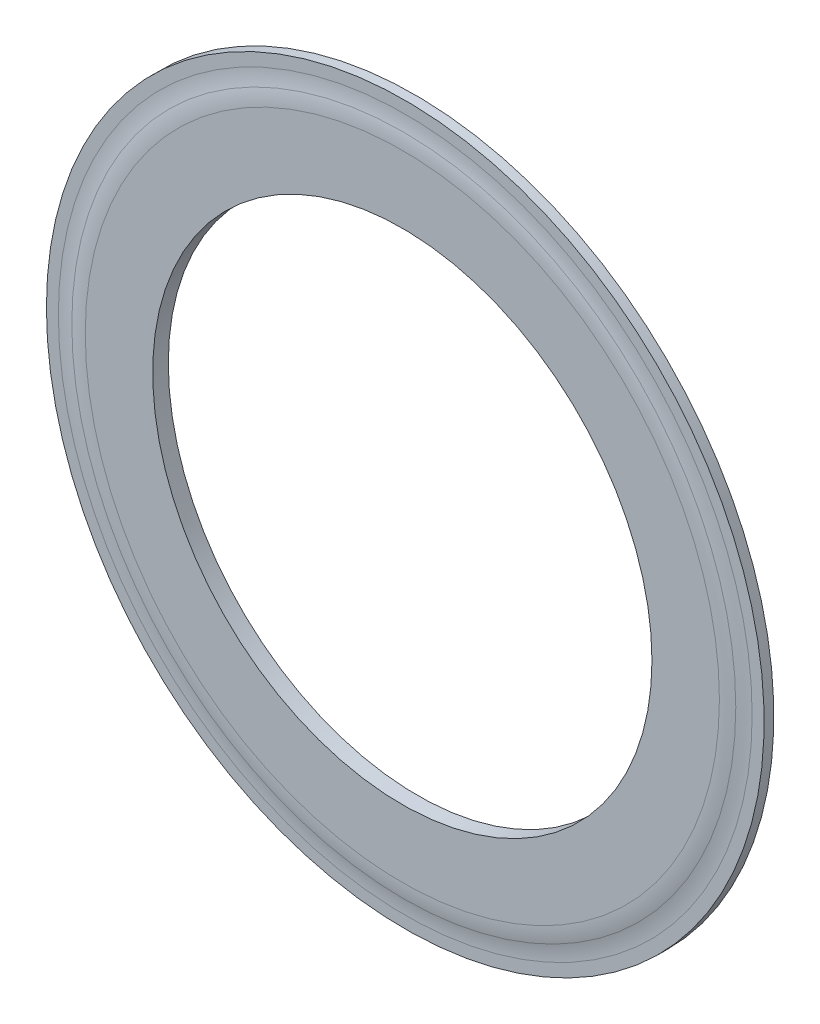
ISO-10303-21;
HEADER;
FILE_DESCRIPTION(('STEP AP214'),'2;1');
FILE_NAME('part.step','',(''),(''),'','','');
FILE_SCHEMA(('AUTOMOTIVE_DESIGN { 1 0 10303 214 1 1 1 1 }'));
ENDSEC;
DATA;
#1=APPLICATION_CONTEXT('core data for automotive mechanical design processes');
#2=APPLICATION_PROTOCOL_DEFINITION('international standard','automotive_design',2000,#1);
#3=PRODUCT_CONTEXT('',#1,'mechanical');
#4=PRODUCT('Part','Part','',(#3));
#5=PRODUCT_RELATED_PRODUCT_CATEGORY('part','',(#4));
#6=PRODUCT_DEFINITION_FORMATION('','',#4);
#7=PRODUCT_DEFINITION_CONTEXT('part definition',#1,'design');
#8=PRODUCT_DEFINITION('design','',#6,#7);
#9=PRODUCT_DEFINITION_SHAPE('','',#8);
#10=(LENGTH_UNIT() NAMED_UNIT(*) SI_UNIT(.MILLI.,.METRE.));
#11=(NAMED_UNIT(*) PLANE_ANGLE_UNIT() SI_UNIT($,.RADIAN.));
#12=(NAMED_UNIT(*) SI_UNIT($,.STERADIAN.) SOLID_ANGLE_UNIT());
#13=UNCERTAINTY_MEASURE_WITH_UNIT(LENGTH_MEASURE(1.E-05),#10,'distance_accuracy_value','');
#14=(GEOMETRIC_REPRESENTATION_CONTEXT(3) GLOBAL_UNCERTAINTY_ASSIGNED_CONTEXT((#13)) GLOBAL_UNIT_ASSIGNED_CONTEXT((#10,
#11,#12)) REPRESENTATION_CONTEXT('',''));
#15=CARTESIAN_POINT('',(0.,0.,0.));
#16=DIRECTION('',(0.,0.,1.));
#17=DIRECTION('',(1.,0.,0.));
#18=AXIS2_PLACEMENT_3D('',#15,#16,#17);
#19=CARTESIAN_POINT('',(0.,36.5125,-0.49609375));
#20=DIRECTION('',(0.,0.,-1.));
#21=DIRECTION('',(-1.,0.,0.));
#22=AXIS2_PLACEMENT_3D('',#19,#20,#21);
#23=PLANE('',#22);
#24=CARTESIAN_POINT('',(0.,0.,-0.49609375));
#25=DIRECTION('',(0.,0.,-1.));
#26=DIRECTION('',(-1.,0.,0.));
#27=AXIS2_PLACEMENT_3D('',#24,#25,#26);
#28=CIRCLE('',#27,36.5125);
#29=CARTESIAN_POINT('',(-36.5125,0.,-0.49609375));
#30=VERTEX_POINT('',#29);
#31=EDGE_CURVE('E10',#30,#30,#28,.T.);
#32=ORIENTED_EDGE('',*,*,#31,.T.);
#33=EDGE_LOOP('',(#32));
#34=FACE_BOUND('',#33,.T.);
#35=CARTESIAN_POINT('',(0.,0.,-0.496093749999999));
#36=DIRECTION('',(0.,0.,-1.));
#37=DIRECTION('',(-1.,0.,0.));
#38=AXIS2_PLACEMENT_3D('',#35,#36,#37);
#39=CIRCLE('',#38,35.2980625);
#40=CARTESIAN_POINT('',(-35.2980625,0.,-0.496093749999999));
#41=VERTEX_POINT('',#40);
#42=EDGE_CURVE('E69',#41,#41,#39,.T.);
#43=ORIENTED_EDGE('',*,*,#42,.F.);
#44=EDGE_LOOP('',(#43));
#45=FACE_BOUND('',#44,.T.);
#46=ADVANCED_FACE('F41',(#34,#45),#23,.T.);
#47=CARTESIAN_POINT('',(0.,0.,-0.793750000000004));
#48=DIRECTION('',(0.,0.,-1.));
#49=DIRECTION('',(-1.,0.,0.));
#50=AXIS2_PLACEMENT_3D('',#47,#48,#49);
#51=CYLINDRICAL_SURFACE('',#50,36.5125);
#52=CARTESIAN_POINT('',(0.,0.,0.49609375));
#53=DIRECTION('',(0.,0.,-1.));
#54=DIRECTION('',(-1.,0.,0.));
#55=AXIS2_PLACEMENT_3D('',#52,#53,#54);
#56=CIRCLE('',#55,36.5125);
#57=CARTESIAN_POINT('',(-36.5125,0.,0.49609375));
#58=VERTEX_POINT('',#57);
#59=EDGE_CURVE('E48',#58,#58,#56,.T.);
#60=ORIENTED_EDGE('',*,*,#59,.T.);
#61=EDGE_LOOP('',(#60));
#62=FACE_BOUND('',#61,.T.);
#63=ORIENTED_EDGE('',*,*,#31,.F.);
#64=EDGE_LOOP('',(#63));
#65=FACE_BOUND('',#64,.T.);
#66=ADVANCED_FACE('F100',(#62,#65),#51,.T.);
#67=CARTESIAN_POINT('',(0.,36.5125,0.49609375));
#68=DIRECTION('',(0.,0.,1.));
#69=DIRECTION('',(1.,0.,0.));
#70=AXIS2_PLACEMENT_3D('',#67,#68,#69);
#71=PLANE('',#70);
#72=CARTESIAN_POINT('',(0.,0.,0.49609375));
#73=DIRECTION('',(0.,0.,-1.));
#74=DIRECTION('',(-1.,0.,0.));
#75=AXIS2_PLACEMENT_3D('',#72,#73,#74);
#76=CIRCLE('',#75,35.2980625);
#77=CARTESIAN_POINT('',(-35.2980625,0.,0.49609375));
#78=VERTEX_POINT('',#77);
#79=EDGE_CURVE('E52',#78,#78,#76,.T.);
#80=ORIENTED_EDGE('',*,*,#79,.T.);
#81=EDGE_LOOP('',(#80));
#82=FACE_BOUND('',#81,.T.);
#83=ORIENTED_EDGE('',*,*,#59,.F.);
#84=EDGE_LOOP('',(#83));
#85=FACE_BOUND('',#84,.T.);
#86=ADVANCED_FACE('F104',(#82,#85),#71,.T.);
#87=CARTESIAN_POINT('',(0.,0.,8.31254687499955));
#88=DIRECTION('',(0.,0.,-1.));
#89=DIRECTION('',(-1.,0.,0.));
#90=AXIS2_PLACEMENT_3D('',#87,#88,#89);
#91=TOROIDAL_SURFACE('',#90,35.2980625,7.81645312499955);
#92=CARTESIAN_POINT('',(0.,0.,0.644921875000007));
#93=DIRECTION('',(0.,0.,-1.));
#94=DIRECTION('',(-1.,0.,0.));
#95=AXIS2_PLACEMENT_3D('',#92,#93,#94);
#96=CIRCLE('',#95,33.780015625);
#97=CARTESIAN_POINT('',(-33.780015625,0.,0.644921875000007));
#98=VERTEX_POINT('',#97);
#99=EDGE_CURVE('E57',#98,#98,#96,.T.);
#100=ORIENTED_EDGE('',*,*,#99,.T.);
#101=EDGE_LOOP('',(#100));
#102=FACE_BOUND('',#101,.T.);
#103=ORIENTED_EDGE('',*,*,#79,.F.);
#104=EDGE_LOOP('',(#103));
#105=FACE_BOUND('',#104,.T.);
#106=ADVANCED_FACE('F113',(#102,#105),#91,.F.);
#107=CARTESIAN_POINT('',(0.,0.,-7.02270312499954));
#108=DIRECTION('',(0.,0.,-1.));
#109=DIRECTION('',(-1.,0.,0.));
#110=AXIS2_PLACEMENT_3D('',#107,#108,#109);
#111=TOROIDAL_SURFACE('',#110,32.26196875,7.81645312499955);
#112=CARTESIAN_POINT('',(0.,0.,0.793750000000017));
#113=DIRECTION('',(0.,0.,-1.));
#114=DIRECTION('',(-1.,0.,0.));
#115=AXIS2_PLACEMENT_3D('',#112,#113,#114);
#116=CIRCLE('',#115,32.26196875);
#117=CARTESIAN_POINT('',(-32.26196875,0.,0.793750000000017));
#118=VERTEX_POINT('',#117);
#119=EDGE_CURVE('E60',#118,#118,#116,.T.);
#120=ORIENTED_EDGE('',*,*,#119,.T.);
#121=EDGE_LOOP('',(#120));
#122=FACE_BOUND('',#121,.T.);
#123=ORIENTED_EDGE('',*,*,#99,.F.);
#124=EDGE_LOOP('',(#123));
#125=FACE_BOUND('',#124,.T.);
#126=ADVANCED_FACE('F120',(#122,#125),#111,.T.);
#127=CARTESIAN_POINT('',(0.,32.26196875,0.793750000000017));
#128=DIRECTION('',(0.,0.,1.));
#129=DIRECTION('',(1.,0.,0.));
#130=AXIS2_PLACEMENT_3D('',#127,#128,#129);
#131=PLANE('',#130);
#132=CARTESIAN_POINT('',(0.,0.,0.793750000000017));
#133=DIRECTION('',(0.,0.,1.));
#134=DIRECTION('',(1.,0.,0.));
#135=AXIS2_PLACEMENT_3D('',#132,#133,#134);
#136=CIRCLE('',#135,25.4);
#137=CARTESIAN_POINT('',(25.4,0.,0.793750000000017));
#138=VERTEX_POINT('',#137);
#139=EDGE_CURVE('E72',#138,#138,#136,.T.);
#140=ORIENTED_EDGE('',*,*,#139,.F.);
#141=EDGE_LOOP('',(#140));
#142=FACE_BOUND('',#141,.T.);
#143=ORIENTED_EDGE('',*,*,#119,.F.);
#144=EDGE_LOOP('',(#143));
#145=FACE_BOUND('',#144,.T.);
#146=ADVANCED_FACE('F85',(#142,#145),#131,.T.);
#147=CARTESIAN_POINT('',(0.,32.26196875,-0.793750000000016));
#148=DIRECTION('',(0.,0.,-1.));
#149=DIRECTION('',(-1.,0.,0.));
#150=AXIS2_PLACEMENT_3D('',#147,#148,#149);
#151=PLANE('',#150);
#152=CARTESIAN_POINT('',(0.,0.,-0.793750000000016));
#153=DIRECTION('',(0.,0.,-1.));
#154=DIRECTION('',(-1.,0.,0.));
#155=AXIS2_PLACEMENT_3D('',#152,#153,#154);
#156=CIRCLE('',#155,25.4);
#157=CARTESIAN_POINT('',(-25.4,0.,-0.793750000000016));
#158=VERTEX_POINT('',#157);
#159=EDGE_CURVE('E44',#158,#158,#156,.T.);
#160=ORIENTED_EDGE('',*,*,#159,.F.);
#161=EDGE_LOOP('',(#160));
#162=FACE_BOUND('',#161,.T.);
#163=CARTESIAN_POINT('',(0.,0.,-0.793750000000017));
#164=DIRECTION('',(0.,0.,-1.));
#165=DIRECTION('',(-1.,0.,0.));
#166=AXIS2_PLACEMENT_3D('',#163,#164,#165);
#167=CIRCLE('',#166,32.26196875);
#168=CARTESIAN_POINT('',(-32.26196875,0.,-0.793750000000017));
#169=VERTEX_POINT('',#168);
#170=EDGE_CURVE('E63',#169,#169,#167,.T.);
#171=ORIENTED_EDGE('',*,*,#170,.T.);
#172=EDGE_LOOP('',(#171));
#173=FACE_BOUND('',#172,.T.);
#174=ADVANCED_FACE('F81',(#162,#173),#151,.T.);
#175=CARTESIAN_POINT('',(0.,0.,7.02270312499954));
#176=DIRECTION('',(0.,0.,-1.));
#177=DIRECTION('',(-1.,0.,0.));
#178=AXIS2_PLACEMENT_3D('',#175,#176,#177);
#179=TOROIDAL_SURFACE('',#178,32.26196875,7.81645312499955);
#180=CARTESIAN_POINT('',(0.,0.,-0.644921875000009));
#181=DIRECTION('',(0.,0.,-1.));
#182=DIRECTION('',(-1.,0.,0.));
#183=AXIS2_PLACEMENT_3D('',#180,#181,#182);
#184=CIRCLE('',#183,33.780015625);
#185=CARTESIAN_POINT('',(-33.780015625,0.,-0.644921875000009));
#186=VERTEX_POINT('',#185);
#187=EDGE_CURVE('E66',#186,#186,#184,.T.);
#188=ORIENTED_EDGE('',*,*,#187,.T.);
#189=EDGE_LOOP('',(#188));
#190=FACE_BOUND('',#189,.T.);
#191=ORIENTED_EDGE('',*,*,#170,.F.);
#192=EDGE_LOOP('',(#191));
#193=FACE_BOUND('',#192,.T.);
#194=ADVANCED_FACE('F84',(#190,#193),#179,.T.);
#195=CARTESIAN_POINT('',(0.,0.,-8.31254687499955));
#196=DIRECTION('',(0.,0.,-1.));
#197=DIRECTION('',(-1.,0.,0.));
#198=AXIS2_PLACEMENT_3D('',#195,#196,#197);
#199=TOROIDAL_SURFACE('',#198,35.2980625,7.81645312499955);
#200=ORIENTED_EDGE('',*,*,#42,.T.);
#201=EDGE_LOOP('',(#200));
#202=FACE_BOUND('',#201,.T.);
#203=ORIENTED_EDGE('',*,*,#187,.F.);
#204=EDGE_LOOP('',(#203));
#205=FACE_BOUND('',#204,.T.);
#206=ADVANCED_FACE('F90',(#202,#205),#199,.F.);
#207=CARTESIAN_POINT('',(0.,0.,-1.74624999999998));
#208=DIRECTION('',(0.,0.,1.));
#209=DIRECTION('',(1.,0.,0.));
#210=AXIS2_PLACEMENT_3D('',#207,#208,#209);
#211=CYLINDRICAL_SURFACE('',#210,25.4);
#212=ORIENTED_EDGE('',*,*,#159,.T.);
#213=EDGE_LOOP('',(#212));
#214=FACE_BOUND('',#213,.T.);
#215=ORIENTED_EDGE('',*,*,#139,.T.);
#216=EDGE_LOOP('',(#215));
#217=FACE_BOUND('',#216,.T.);
#218=ADVANCED_FACE('F79',(#214,#217),#211,.F.);
#219=CLOSED_SHELL('',(#46,#66,#86,#106,#126,#146,#174,#194,#206,#218));
#220=MANIFOLD_SOLID_BREP('B2',#219);
#221=ADVANCED_BREP_SHAPE_REPRESENTATION('',(#18,#220),#14);
#222=SHAPE_DEFINITION_REPRESENTATION(#9,#221);
ENDSEC;
END-ISO-10303-21;
